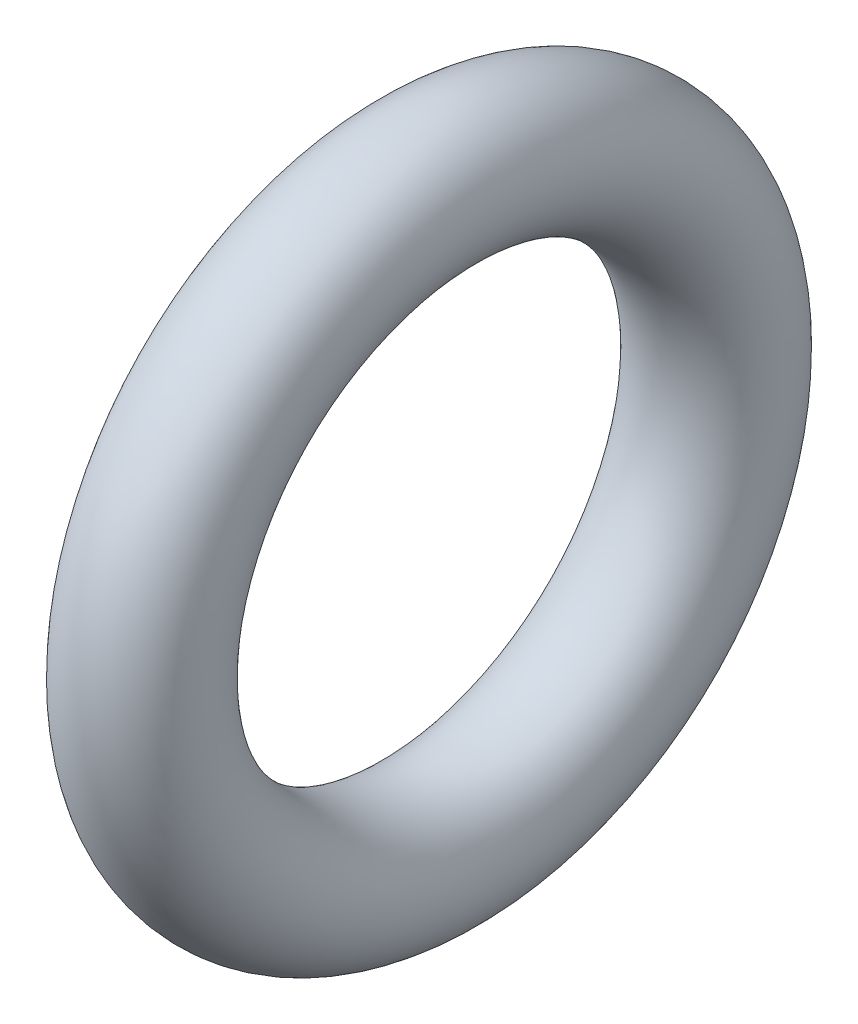
ISO-10303-21;
HEADER;
FILE_DESCRIPTION(('STEP AP214'),'2;1');
FILE_NAME('part.step','',(''),(''),'','','');
FILE_SCHEMA(('AUTOMOTIVE_DESIGN { 1 0 10303 214 1 1 1 1 }'));
ENDSEC;
DATA;
#1=APPLICATION_CONTEXT('core data for automotive mechanical design processes');
#2=APPLICATION_PROTOCOL_DEFINITION('international standard','automotive_design',2000,#1);
#3=PRODUCT_CONTEXT('',#1,'mechanical');
#4=PRODUCT('Part','Part','',(#3));
#5=PRODUCT_RELATED_PRODUCT_CATEGORY('part','',(#4));
#6=PRODUCT_DEFINITION_FORMATION('','',#4);
#7=PRODUCT_DEFINITION_CONTEXT('part definition',#1,'design');
#8=PRODUCT_DEFINITION('design','',#6,#7);
#9=PRODUCT_DEFINITION_SHAPE('','',#8);
#10=(LENGTH_UNIT() NAMED_UNIT(*) SI_UNIT(.MILLI.,.METRE.));
#11=(NAMED_UNIT(*) PLANE_ANGLE_UNIT() SI_UNIT($,.RADIAN.));
#12=(NAMED_UNIT(*) SI_UNIT($,.STERADIAN.) SOLID_ANGLE_UNIT());
#13=UNCERTAINTY_MEASURE_WITH_UNIT(LENGTH_MEASURE(1.E-05),#10,'distance_accuracy_value','');
#14=(GEOMETRIC_REPRESENTATION_CONTEXT(3) GLOBAL_UNCERTAINTY_ASSIGNED_CONTEXT((#13)) GLOBAL_UNIT_ASSIGNED_CONTEXT((#10,
#11,#12)) REPRESENTATION_CONTEXT('',''));
#15=CARTESIAN_POINT('',(0.,0.,0.));
#16=DIRECTION('',(0.,0.,1.));
#17=DIRECTION('',(1.,0.,0.));
#18=AXIS2_PLACEMENT_3D('',#15,#16,#17);
#19=CARTESIAN_POINT('',(-91.0922889212897,0.,0.309546528854384));
#20=DIRECTION('',(-1.,0.,0.));
#21=DIRECTION('',(0.,0.,1.));
#22=AXIS2_PLACEMENT_3D('',#19,#20,#21);
#23=TOROIDAL_SURFACE('',#22,3.1375,0.737500000000006);
#24=CARTESIAN_POINT('',(-91.0922889212897,0.,4.18454652885439));
#25=VERTEX_POINT('',#24);
#26=VERTEX_LOOP('',#25);
#27=FACE_BOUND('',#26,.T.);
#28=ADVANCED_FACE('F33',(#27),#23,.T.);
#29=CLOSED_SHELL('',(#28));
#30=MANIFOLD_SOLID_BREP('B2',#29);
#31=ADVANCED_BREP_SHAPE_REPRESENTATION('',(#18,#30),#14);
#32=SHAPE_DEFINITION_REPRESENTATION(#9,#31);
ENDSEC;
END-ISO-10303-21;
